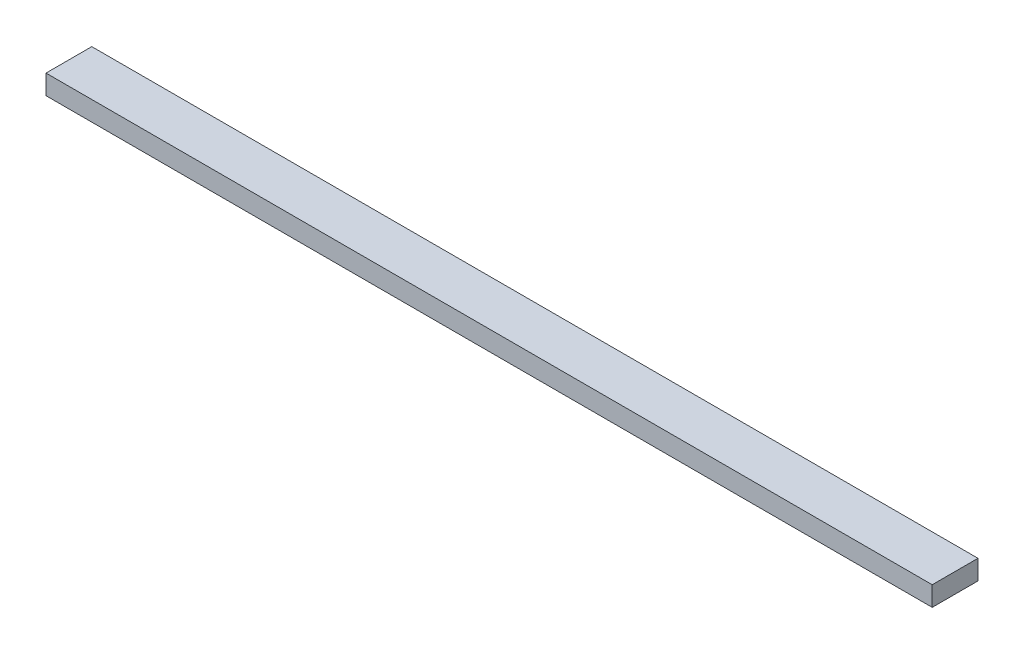
ISO-10303-21;
HEADER;
FILE_DESCRIPTION(('STEP AP214'),'2;1');
FILE_NAME('part.step','',(''),(''),'','','');
FILE_SCHEMA(('AUTOMOTIVE_DESIGN { 1 0 10303 214 1 1 1 1 }'));
ENDSEC;
DATA;
#1=APPLICATION_CONTEXT('core data for automotive mechanical design processes');
#2=APPLICATION_PROTOCOL_DEFINITION('international standard','automotive_design',2000,#1);
#3=PRODUCT_CONTEXT('',#1,'mechanical');
#4=PRODUCT('Part','Part','',(#3));
#5=PRODUCT_RELATED_PRODUCT_CATEGORY('part','',(#4));
#6=PRODUCT_DEFINITION_FORMATION('','',#4);
#7=PRODUCT_DEFINITION_CONTEXT('part definition',#1,'design');
#8=PRODUCT_DEFINITION('design','',#6,#7);
#9=PRODUCT_DEFINITION_SHAPE('','',#8);
#10=(LENGTH_UNIT() NAMED_UNIT(*) SI_UNIT(.MILLI.,.METRE.));
#11=(NAMED_UNIT(*) PLANE_ANGLE_UNIT() SI_UNIT($,.RADIAN.));
#12=(NAMED_UNIT(*) SI_UNIT($,.STERADIAN.) SOLID_ANGLE_UNIT());
#13=UNCERTAINTY_MEASURE_WITH_UNIT(LENGTH_MEASURE(1.E-05),#10,'distance_accuracy_value','');
#14=(GEOMETRIC_REPRESENTATION_CONTEXT(3) GLOBAL_UNCERTAINTY_ASSIGNED_CONTEXT((#13)) GLOBAL_UNIT_ASSIGNED_CONTEXT((#10,
#11,#12)) REPRESENTATION_CONTEXT('',''));
#15=CARTESIAN_POINT('',(0.,0.,0.));
#16=DIRECTION('',(0.,0.,1.));
#17=DIRECTION('',(1.,0.,0.));
#18=AXIS2_PLACEMENT_3D('',#15,#16,#17);
#19=CARTESIAN_POINT('',(67.75,-1.5,7.));
#20=DIRECTION('',(-1.,0.,0.));
#21=DIRECTION('',(0.,0.,1.));
#22=AXIS2_PLACEMENT_3D('',#19,#20,#21);
#23=PLANE('',#22);
#24=DIRECTION('',(0.,1.,0.));
#25=VECTOR('',#24,1.);
#26=CARTESIAN_POINT('',(67.75,-1.5,0.));
#27=LINE('',#26,#25);
#28=CARTESIAN_POINT('',(67.75,-1.5,0.));
#29=VERTEX_POINT('',#28);
#30=CARTESIAN_POINT('',(67.75,1.5,0.));
#31=VERTEX_POINT('',#30);
#32=EDGE_CURVE('E111',#29,#31,#27,.T.);
#33=ORIENTED_EDGE('',*,*,#32,.T.);
#34=DIRECTION('',(0.,0.,-1.));
#35=VECTOR('',#34,1.);
#36=CARTESIAN_POINT('',(67.75,1.5,7.));
#37=LINE('',#36,#35);
#38=CARTESIAN_POINT('',(67.75,1.5,7.));
#39=VERTEX_POINT('',#38);
#40=EDGE_CURVE('E11',#39,#31,#37,.T.);
#41=ORIENTED_EDGE('',*,*,#40,.F.);
#42=DIRECTION('',(0.,1.,0.));
#43=VECTOR('',#42,1.);
#44=CARTESIAN_POINT('',(67.75,-1.5,7.));
#45=LINE('',#44,#43);
#46=CARTESIAN_POINT('',(67.75,-1.5,7.));
#47=VERTEX_POINT('',#46);
#48=EDGE_CURVE('E95',#47,#39,#45,.T.);
#49=ORIENTED_EDGE('',*,*,#48,.F.);
#50=DIRECTION('',(0.,0.,-1.));
#51=VECTOR('',#50,1.);
#52=CARTESIAN_POINT('',(67.75,-1.5,7.));
#53=LINE('',#52,#51);
#54=EDGE_CURVE('E107',#47,#29,#53,.T.);
#55=ORIENTED_EDGE('',*,*,#54,.T.);
#56=EDGE_LOOP('',(#33,#41,#49,#55));
#57=FACE_BOUND('',#56,.T.);
#58=ADVANCED_FACE('F43',(#57),#23,.F.);
#59=CARTESIAN_POINT('',(-67.75,1.5,7.));
#60=DIRECTION('',(0.,-1.,0.));
#61=DIRECTION('',(0.,0.,-1.));
#62=AXIS2_PLACEMENT_3D('',#59,#60,#61);
#63=PLANE('',#62);
#64=DIRECTION('',(-1.,0.,0.));
#65=VECTOR('',#64,1.);
#66=CARTESIAN_POINT('',(-67.75,1.5,0.));
#67=LINE('',#66,#65);
#68=CARTESIAN_POINT('',(-67.75,1.5,0.));
#69=VERTEX_POINT('',#68);
#70=EDGE_CURVE('E100',#31,#69,#67,.T.);
#71=ORIENTED_EDGE('',*,*,#70,.T.);
#72=DIRECTION('',(0.,0.,-1.));
#73=VECTOR('',#72,1.);
#74=CARTESIAN_POINT('',(-67.75,1.5,7.));
#75=LINE('',#74,#73);
#76=CARTESIAN_POINT('',(-67.75,1.5,7.));
#77=VERTEX_POINT('',#76);
#78=EDGE_CURVE('E52',#77,#69,#75,.T.);
#79=ORIENTED_EDGE('',*,*,#78,.F.);
#80=DIRECTION('',(-1.,0.,0.));
#81=VECTOR('',#80,1.);
#82=CARTESIAN_POINT('',(-67.75,1.5,7.));
#83=LINE('',#82,#81);
#84=EDGE_CURVE('E90',#39,#77,#83,.T.);
#85=ORIENTED_EDGE('',*,*,#84,.F.);
#86=ORIENTED_EDGE('',*,*,#40,.T.);
#87=EDGE_LOOP('',(#71,#79,#85,#86));
#88=FACE_BOUND('',#87,.T.);
#89=ADVANCED_FACE('F99',(#88),#63,.F.);
#90=CARTESIAN_POINT('',(-67.75,-1.5,7.));
#91=DIRECTION('',(1.,0.,0.));
#92=DIRECTION('',(0.,0.,-1.));
#93=AXIS2_PLACEMENT_3D('',#90,#91,#92);
#94=PLANE('',#93);
#95=DIRECTION('',(0.,-1.,0.));
#96=VECTOR('',#95,1.);
#97=CARTESIAN_POINT('',(-67.75,-1.5,0.));
#98=LINE('',#97,#96);
#99=CARTESIAN_POINT('',(-67.75,-1.5,0.));
#100=VERTEX_POINT('',#99);
#101=EDGE_CURVE('E77',#69,#100,#98,.T.);
#102=ORIENTED_EDGE('',*,*,#101,.T.);
#103=DIRECTION('',(0.,0.,-1.));
#104=VECTOR('',#103,1.);
#105=CARTESIAN_POINT('',(-67.75,-1.5,7.));
#106=LINE('',#105,#104);
#107=CARTESIAN_POINT('',(-67.75,-1.5,7.));
#108=VERTEX_POINT('',#107);
#109=EDGE_CURVE('E102',#108,#100,#106,.T.);
#110=ORIENTED_EDGE('',*,*,#109,.F.);
#111=DIRECTION('',(0.,-1.,0.));
#112=VECTOR('',#111,1.);
#113=CARTESIAN_POINT('',(-67.75,-1.5,7.));
#114=LINE('',#113,#112);
#115=EDGE_CURVE('E93',#77,#108,#114,.T.);
#116=ORIENTED_EDGE('',*,*,#115,.F.);
#117=ORIENTED_EDGE('',*,*,#78,.T.);
#118=EDGE_LOOP('',(#102,#110,#116,#117));
#119=FACE_BOUND('',#118,.T.);
#120=ADVANCED_FACE('F103',(#119),#94,.F.);
#121=CARTESIAN_POINT('',(-67.75,-1.5,7.));
#122=DIRECTION('',(0.,1.,0.));
#123=DIRECTION('',(0.,0.,1.));
#124=AXIS2_PLACEMENT_3D('',#121,#122,#123);
#125=PLANE('',#124);
#126=DIRECTION('',(1.,0.,0.));
#127=VECTOR('',#126,1.);
#128=CARTESIAN_POINT('',(-67.75,-1.5,0.));
#129=LINE('',#128,#127);
#130=EDGE_CURVE('E83',#100,#29,#129,.T.);
#131=ORIENTED_EDGE('',*,*,#130,.T.);
#132=ORIENTED_EDGE('',*,*,#54,.F.);
#133=DIRECTION('',(1.,0.,0.));
#134=VECTOR('',#133,1.);
#135=CARTESIAN_POINT('',(-67.75,-1.5,7.));
#136=LINE('',#135,#134);
#137=EDGE_CURVE('E60',#108,#47,#136,.T.);
#138=ORIENTED_EDGE('',*,*,#137,.F.);
#139=ORIENTED_EDGE('',*,*,#109,.T.);
#140=EDGE_LOOP('',(#131,#132,#138,#139));
#141=FACE_BOUND('',#140,.T.);
#142=ADVANCED_FACE('F124',(#141),#125,.F.);
#143=CARTESIAN_POINT('',(0.,0.,7.));
#144=DIRECTION('',(0.,0.,-1.));
#145=DIRECTION('',(-1.,0.,0.));
#146=AXIS2_PLACEMENT_3D('',#143,#144,#145);
#147=PLANE('',#146);
#148=ORIENTED_EDGE('',*,*,#48,.T.);
#149=ORIENTED_EDGE('',*,*,#84,.T.);
#150=ORIENTED_EDGE('',*,*,#115,.T.);
#151=ORIENTED_EDGE('',*,*,#137,.T.);
#152=EDGE_LOOP('',(#148,#149,#150,#151));
#153=FACE_BOUND('',#152,.T.);
#154=ADVANCED_FACE('F91',(#153),#147,.F.);
#155=CARTESIAN_POINT('',(0.,0.,0.));
#156=DIRECTION('',(0.,0.,-1.));
#157=DIRECTION('',(-1.,0.,0.));
#158=AXIS2_PLACEMENT_3D('',#155,#156,#157);
#159=PLANE('',#158);
#160=ORIENTED_EDGE('',*,*,#32,.F.);
#161=ORIENTED_EDGE('',*,*,#130,.F.);
#162=ORIENTED_EDGE('',*,*,#101,.F.);
#163=ORIENTED_EDGE('',*,*,#70,.F.);
#164=EDGE_LOOP('',(#160,#161,#162,#163));
#165=FACE_BOUND('',#164,.T.);
#166=ADVANCED_FACE('F127',(#165),#159,.T.);
#167=CLOSED_SHELL('',(#58,#89,#120,#142,#154,#166));
#168=MANIFOLD_SOLID_BREP('B2',#167);
#169=ADVANCED_BREP_SHAPE_REPRESENTATION('',(#18,#168),#14);
#170=SHAPE_DEFINITION_REPRESENTATION(#9,#169);
ENDSEC;
END-ISO-10303-21;
